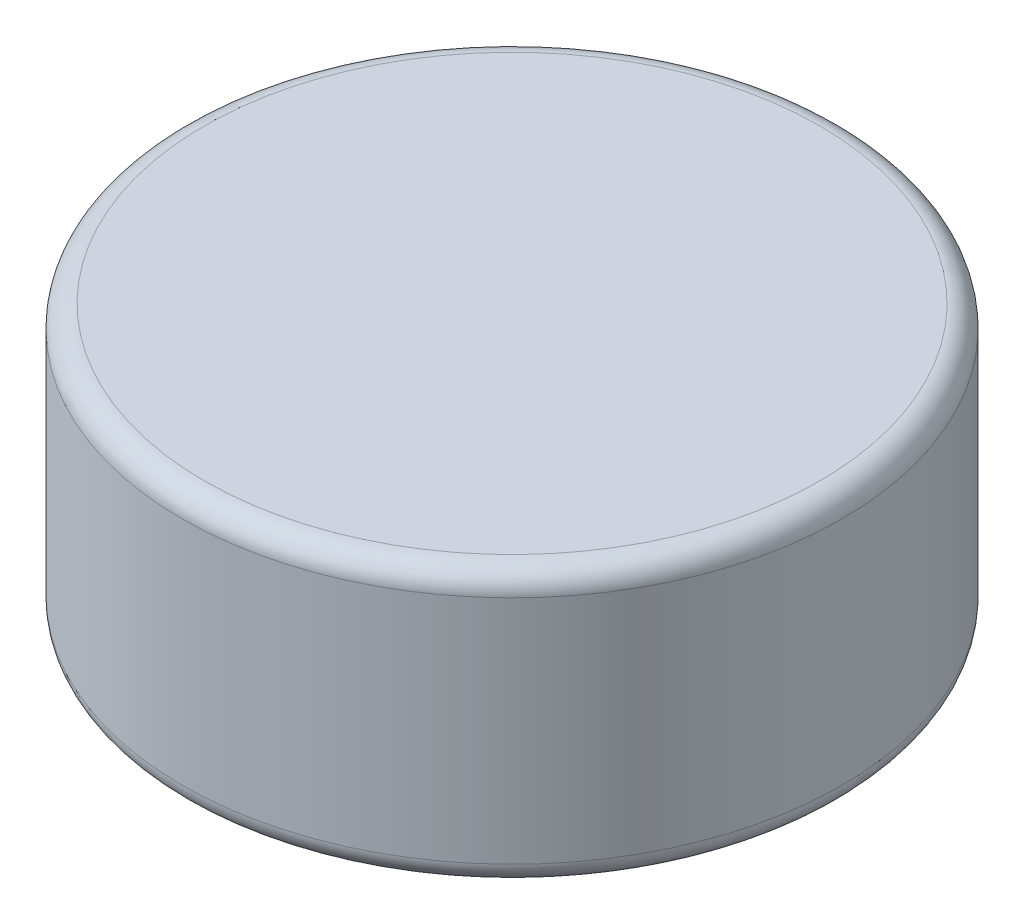
ISO-10303-21;
HEADER;
FILE_DESCRIPTION(('STEP AP214'),'2;1');
FILE_NAME('part.step','',(''),(''),'','','');
FILE_SCHEMA(('AUTOMOTIVE_DESIGN { 1 0 10303 214 1 1 1 1 }'));
ENDSEC;
DATA;
#1=APPLICATION_CONTEXT('core data for automotive mechanical design processes');
#2=APPLICATION_PROTOCOL_DEFINITION('international standard','automotive_design',2000,#1);
#3=PRODUCT_CONTEXT('',#1,'mechanical');
#4=PRODUCT('Part','Part','',(#3));
#5=PRODUCT_RELATED_PRODUCT_CATEGORY('part','',(#4));
#6=PRODUCT_DEFINITION_FORMATION('','',#4);
#7=PRODUCT_DEFINITION_CONTEXT('part definition',#1,'design');
#8=PRODUCT_DEFINITION('design','',#6,#7);
#9=PRODUCT_DEFINITION_SHAPE('','',#8);
#10=(LENGTH_UNIT() NAMED_UNIT(*) SI_UNIT(.MILLI.,.METRE.));
#11=(NAMED_UNIT(*) PLANE_ANGLE_UNIT() SI_UNIT($,.RADIAN.));
#12=(NAMED_UNIT(*) SI_UNIT($,.STERADIAN.) SOLID_ANGLE_UNIT());
#13=UNCERTAINTY_MEASURE_WITH_UNIT(LENGTH_MEASURE(1.E-05),#10,'distance_accuracy_value','');
#14=(GEOMETRIC_REPRESENTATION_CONTEXT(3) GLOBAL_UNCERTAINTY_ASSIGNED_CONTEXT((#13)) GLOBAL_UNIT_ASSIGNED_CONTEXT((#10,
#11,#12)) REPRESENTATION_CONTEXT('',''));
#15=CARTESIAN_POINT('',(0.,0.,0.));
#16=DIRECTION('',(0.,0.,1.));
#17=DIRECTION('',(1.,0.,0.));
#18=AXIS2_PLACEMENT_3D('',#15,#16,#17);
#19=CARTESIAN_POINT('',(0.,1.25,0.));
#20=DIRECTION('',(0.,-1.,0.));
#21=DIRECTION('',(0.,0.,-1.));
#22=AXIS2_PLACEMENT_3D('',#19,#20,#21);
#23=CYLINDRICAL_SURFACE('',#22,3.);
#24=CARTESIAN_POINT('',(0.,-1.05,0.));
#25=DIRECTION('',(0.,1.,0.));
#26=DIRECTION('',(0.,0.,1.));
#27=AXIS2_PLACEMENT_3D('',#24,#25,#26);
#28=CIRCLE('',#27,3.);
#29=CARTESIAN_POINT('',(0.,-1.05,3.));
#30=VERTEX_POINT('',#29);
#31=EDGE_CURVE('E50',#30,#30,#28,.T.);
#32=ORIENTED_EDGE('',*,*,#31,.T.);
#33=EDGE_LOOP('',(#32));
#34=FACE_BOUND('',#33,.T.);
#35=CARTESIAN_POINT('',(0.,1.05,0.));
#36=DIRECTION('',(0.,1.,0.));
#37=DIRECTION('',(0.,0.,1.));
#38=AXIS2_PLACEMENT_3D('',#35,#36,#37);
#39=CIRCLE('',#38,3.);
#40=CARTESIAN_POINT('',(0.,1.05,3.));
#41=VERTEX_POINT('',#40);
#42=EDGE_CURVE('E55',#41,#41,#39,.F.);
#43=ORIENTED_EDGE('',*,*,#42,.T.);
#44=EDGE_LOOP('',(#43));
#45=FACE_BOUND('',#44,.T.);
#46=ADVANCED_FACE('F37',(#34,#45),#23,.T.);
#47=CARTESIAN_POINT('',(0.,1.25,0.));
#48=DIRECTION('',(0.,1.,0.));
#49=DIRECTION('',(0.,0.,1.));
#50=AXIS2_PLACEMENT_3D('',#47,#48,#49);
#51=PLANE('',#50);
#52=CARTESIAN_POINT('',(0.,1.25,0.));
#53=DIRECTION('',(0.,1.,0.));
#54=DIRECTION('',(0.,0.,1.));
#55=AXIS2_PLACEMENT_3D('',#52,#53,#54);
#56=CIRCLE('',#55,2.8);
#57=CARTESIAN_POINT('',(0.,1.25,2.8));
#58=VERTEX_POINT('',#57);
#59=EDGE_CURVE('E10',#58,#58,#56,.T.);
#60=ORIENTED_EDGE('',*,*,#59,.T.);
#61=EDGE_LOOP('',(#60));
#62=FACE_BOUND('',#61,.T.);
#63=ADVANCED_FACE('F72',(#62),#51,.T.);
#64=CARTESIAN_POINT('',(0.,-1.25,0.));
#65=DIRECTION('',(0.,1.,0.));
#66=DIRECTION('',(0.,0.,1.));
#67=AXIS2_PLACEMENT_3D('',#64,#65,#66);
#68=PLANE('',#67);
#69=CARTESIAN_POINT('',(0.,-1.25,0.));
#70=DIRECTION('',(0.,1.,0.));
#71=DIRECTION('',(0.,0.,1.));
#72=AXIS2_PLACEMENT_3D('',#69,#70,#71);
#73=CIRCLE('',#72,2.8);
#74=CARTESIAN_POINT('',(0.,-1.25,2.8));
#75=VERTEX_POINT('',#74);
#76=EDGE_CURVE('E45',#75,#75,#73,.F.);
#77=ORIENTED_EDGE('',*,*,#76,.T.);
#78=EDGE_LOOP('',(#77));
#79=FACE_BOUND('',#78,.T.);
#80=ADVANCED_FACE('F69',(#79),#68,.F.);
#81=CARTESIAN_POINT('',(0.,-1.05,0.));
#82=DIRECTION('',(0.,1.,0.));
#83=DIRECTION('',(0.,0.,1.));
#84=AXIS2_PLACEMENT_3D('',#81,#82,#83);
#85=TOROIDAL_SURFACE('',#84,2.8,0.2);
#86=ORIENTED_EDGE('',*,*,#76,.F.);
#87=EDGE_LOOP('',(#86));
#88=FACE_BOUND('',#87,.T.);
#89=ORIENTED_EDGE('',*,*,#31,.F.);
#90=EDGE_LOOP('',(#89));
#91=FACE_BOUND('',#90,.T.);
#92=ADVANCED_FACE('F65',(#88,#91),#85,.T.);
#93=CARTESIAN_POINT('',(0.,1.05,0.));
#94=DIRECTION('',(0.,1.,0.));
#95=DIRECTION('',(0.,0.,1.));
#96=AXIS2_PLACEMENT_3D('',#93,#94,#95);
#97=TOROIDAL_SURFACE('',#96,2.8,0.2);
#98=ORIENTED_EDGE('',*,*,#42,.F.);
#99=EDGE_LOOP('',(#98));
#100=FACE_BOUND('',#99,.T.);
#101=ORIENTED_EDGE('',*,*,#59,.F.);
#102=EDGE_LOOP('',(#101));
#103=FACE_BOUND('',#102,.T.);
#104=ADVANCED_FACE('F39',(#100,#103),#97,.T.);
#105=CLOSED_SHELL('',(#46,#63,#80,#92,#104));
#106=MANIFOLD_SOLID_BREP('B2',#105);
#107=ADVANCED_BREP_SHAPE_REPRESENTATION('',(#18,#106),#14);
#108=SHAPE_DEFINITION_REPRESENTATION(#9,#107);
ENDSEC;
END-ISO-10303-21;
